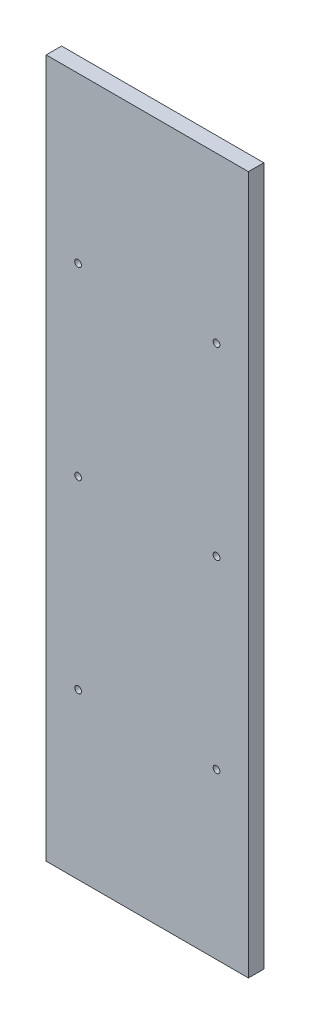
ISO-10303-21;
HEADER;
FILE_DESCRIPTION(('STEP AP214'),'2;1');
FILE_NAME('part.step','',(''),(''),'','','');
FILE_SCHEMA(('AUTOMOTIVE_DESIGN { 1 0 10303 214 1 1 1 1 }'));
ENDSEC;
DATA;
#1=APPLICATION_CONTEXT('core data for automotive mechanical design processes');
#2=APPLICATION_PROTOCOL_DEFINITION('international standard','automotive_design',2000,#1);
#3=PRODUCT_CONTEXT('',#1,'mechanical');
#4=PRODUCT('Part','Part','',(#3));
#5=PRODUCT_RELATED_PRODUCT_CATEGORY('part','',(#4));
#6=PRODUCT_DEFINITION_FORMATION('','',#4);
#7=PRODUCT_DEFINITION_CONTEXT('part definition',#1,'design');
#8=PRODUCT_DEFINITION('design','',#6,#7);
#9=PRODUCT_DEFINITION_SHAPE('','',#8);
#10=(LENGTH_UNIT() NAMED_UNIT(*) SI_UNIT(.MILLI.,.METRE.));
#11=(NAMED_UNIT(*) PLANE_ANGLE_UNIT() SI_UNIT($,.RADIAN.));
#12=(NAMED_UNIT(*) SI_UNIT($,.STERADIAN.) SOLID_ANGLE_UNIT());
#13=UNCERTAINTY_MEASURE_WITH_UNIT(LENGTH_MEASURE(1.E-05),#10,'distance_accuracy_value','');
#14=(GEOMETRIC_REPRESENTATION_CONTEXT(3) GLOBAL_UNCERTAINTY_ASSIGNED_CONTEXT((#13)) GLOBAL_UNIT_ASSIGNED_CONTEXT((#10,
#11,#12)) REPRESENTATION_CONTEXT('',''));
#15=CARTESIAN_POINT('',(0.,0.,0.));
#16=DIRECTION('',(0.,0.,1.));
#17=DIRECTION('',(1.,0.,0.));
#18=AXIS2_PLACEMENT_3D('',#15,#16,#17);
#19=CARTESIAN_POINT('',(0.,0.,6.35));
#20=DIRECTION('',(0.,0.,1.));
#21=DIRECTION('',(1.,0.,0.));
#22=AXIS2_PLACEMENT_3D('',#19,#20,#21);
#23=PLANE('',#22);
#24=CARTESIAN_POINT('',(70.325,-67.945,6.35));
#25=DIRECTION('',(0.,0.,1.));
#26=DIRECTION('',(1.,0.,0.));
#27=AXIS2_PLACEMENT_3D('',#24,#25,#26);
#28=CIRCLE('',#27,1.38906249999997);
#29=CARTESIAN_POINT('',(71.7140625,-67.945,6.35));
#30=VERTEX_POINT('',#29);
#31=EDGE_CURVE('E158',#30,#30,#28,.T.);
#32=ORIENTED_EDGE('',*,*,#31,.F.);
#33=EDGE_LOOP('',(#32));
#34=FACE_BOUND('',#33,.T.);
#35=CARTESIAN_POINT('',(70.325,-144.145,6.35));
#36=DIRECTION('',(0.,0.,1.));
#37=DIRECTION('',(1.,0.,0.));
#38=AXIS2_PLACEMENT_3D('',#35,#36,#37);
#39=CIRCLE('',#38,1.38906249999998);
#40=CARTESIAN_POINT('',(71.7140625,-144.145,6.35));
#41=VERTEX_POINT('',#40);
#42=EDGE_CURVE('E142',#41,#41,#39,.T.);
#43=ORIENTED_EDGE('',*,*,#42,.F.);
#44=EDGE_LOOP('',(#43));
#45=FACE_BOUND('',#44,.T.);
#46=CARTESIAN_POINT('',(13.175,-220.345,6.35));
#47=DIRECTION('',(0.,0.,1.));
#48=DIRECTION('',(1.,0.,0.));
#49=AXIS2_PLACEMENT_3D('',#46,#47,#48);
#50=CIRCLE('',#49,1.38906250000001);
#51=CARTESIAN_POINT('',(14.5640625,-220.345,6.35));
#52=VERTEX_POINT('',#51);
#53=EDGE_CURVE('E112',#52,#52,#50,.T.);
#54=ORIENTED_EDGE('',*,*,#53,.F.);
#55=EDGE_LOOP('',(#54));
#56=FACE_BOUND('',#55,.T.);
#57=DIRECTION('',(0.,1.,0.));
#58=VECTOR('',#57,1.);
#59=CARTESIAN_POINT('',(83.5,-288.29,6.35));
#60=LINE('',#59,#58);
#61=CARTESIAN_POINT('',(83.5,-288.29,6.35));
#62=VERTEX_POINT('',#61);
#63=CARTESIAN_POINT('',(83.5,0.,6.35));
#64=VERTEX_POINT('',#63);
#65=EDGE_CURVE('E92',#62,#64,#60,.T.);
#66=ORIENTED_EDGE('',*,*,#65,.T.);
#67=DIRECTION('',(-1.,0.,0.));
#68=VECTOR('',#67,1.);
#69=CARTESIAN_POINT('',(83.5,0.,6.35));
#70=LINE('',#69,#68);
#71=CARTESIAN_POINT('',(0.,0.,6.35));
#72=VERTEX_POINT('',#71);
#73=EDGE_CURVE('E87',#64,#72,#70,.T.);
#74=ORIENTED_EDGE('',*,*,#73,.T.);
#75=DIRECTION('',(0.,-1.,0.));
#76=VECTOR('',#75,1.);
#77=CARTESIAN_POINT('',(0.,0.,6.35));
#78=LINE('',#77,#76);
#79=CARTESIAN_POINT('',(0.,-288.29,6.35));
#80=VERTEX_POINT('',#79);
#81=EDGE_CURVE('E90',#72,#80,#78,.T.);
#82=ORIENTED_EDGE('',*,*,#81,.T.);
#83=DIRECTION('',(1.,0.,0.));
#84=VECTOR('',#83,1.);
#85=CARTESIAN_POINT('',(0.,-288.29,6.35));
#86=LINE('',#85,#84);
#87=EDGE_CURVE('E57',#80,#62,#86,.T.);
#88=ORIENTED_EDGE('',*,*,#87,.T.);
#89=EDGE_LOOP('',(#66,#74,#82,#88));
#90=FACE_BOUND('',#89,.T.);
#91=CARTESIAN_POINT('',(70.325,-220.345,6.35));
#92=DIRECTION('',(0.,0.,1.));
#93=DIRECTION('',(1.,0.,0.));
#94=AXIS2_PLACEMENT_3D('',#91,#92,#93);
#95=CIRCLE('',#94,1.38906249999998);
#96=CARTESIAN_POINT('',(71.7140625,-220.345,6.35));
#97=VERTEX_POINT('',#96);
#98=EDGE_CURVE('E134',#97,#97,#95,.T.);
#99=ORIENTED_EDGE('',*,*,#98,.F.);
#100=EDGE_LOOP('',(#99));
#101=FACE_BOUND('',#100,.T.);
#102=CARTESIAN_POINT('',(13.175,-67.945,6.35));
#103=DIRECTION('',(0.,0.,1.));
#104=DIRECTION('',(1.,0.,0.));
#105=AXIS2_PLACEMENT_3D('',#102,#103,#104);
#106=CIRCLE('',#105,1.38906250000001);
#107=CARTESIAN_POINT('',(14.5640625,-67.945,6.35));
#108=VERTEX_POINT('',#107);
#109=EDGE_CURVE('E150',#108,#108,#106,.T.);
#110=ORIENTED_EDGE('',*,*,#109,.F.);
#111=EDGE_LOOP('',(#110));
#112=FACE_BOUND('',#111,.T.);
#113=CARTESIAN_POINT('',(13.175,-144.145,6.35));
#114=DIRECTION('',(0.,0.,1.));
#115=DIRECTION('',(1.,0.,0.));
#116=AXIS2_PLACEMENT_3D('',#113,#114,#115);
#117=CIRCLE('',#116,1.38906250000001);
#118=CARTESIAN_POINT('',(14.5640625,-144.145,6.35));
#119=VERTEX_POINT('',#118);
#120=EDGE_CURVE('E166',#119,#119,#117,.T.);
#121=ORIENTED_EDGE('',*,*,#120,.F.);
#122=EDGE_LOOP('',(#121));
#123=FACE_BOUND('',#122,.T.);
#124=ADVANCED_FACE('F39',(#34,#45,#56,#90,#101,#112,#123),#23,.T.);
#125=CARTESIAN_POINT('',(0.,0.,0.));
#126=DIRECTION('',(0.,0.,1.));
#127=DIRECTION('',(1.,0.,0.));
#128=AXIS2_PLACEMENT_3D('',#125,#126,#127);
#129=PLANE('',#128);
#130=DIRECTION('',(0.,1.,0.));
#131=VECTOR('',#130,1.);
#132=CARTESIAN_POINT('',(83.5,-288.29,0.));
#133=LINE('',#132,#131);
#134=CARTESIAN_POINT('',(83.5,-288.29,0.));
#135=VERTEX_POINT('',#134);
#136=CARTESIAN_POINT('',(83.5,0.,0.));
#137=VERTEX_POINT('',#136);
#138=EDGE_CURVE('E108',#135,#137,#133,.T.);
#139=ORIENTED_EDGE('',*,*,#138,.F.);
#140=DIRECTION('',(1.,0.,0.));
#141=VECTOR('',#140,1.);
#142=CARTESIAN_POINT('',(0.,-288.29,0.));
#143=LINE('',#142,#141);
#144=CARTESIAN_POINT('',(0.,-288.29,0.));
#145=VERTEX_POINT('',#144);
#146=EDGE_CURVE('E80',#145,#135,#143,.T.);
#147=ORIENTED_EDGE('',*,*,#146,.F.);
#148=DIRECTION('',(0.,-1.,0.));
#149=VECTOR('',#148,1.);
#150=CARTESIAN_POINT('',(0.,0.,0.));
#151=LINE('',#150,#149);
#152=CARTESIAN_POINT('',(0.,0.,0.));
#153=VERTEX_POINT('',#152);
#154=EDGE_CURVE('E74',#153,#145,#151,.T.);
#155=ORIENTED_EDGE('',*,*,#154,.F.);
#156=DIRECTION('',(-1.,0.,0.));
#157=VECTOR('',#156,1.);
#158=CARTESIAN_POINT('',(83.5,0.,0.));
#159=LINE('',#158,#157);
#160=EDGE_CURVE('E97',#137,#153,#159,.T.);
#161=ORIENTED_EDGE('',*,*,#160,.F.);
#162=EDGE_LOOP('',(#139,#147,#155,#161));
#163=FACE_BOUND('',#162,.T.);
#164=CARTESIAN_POINT('',(13.175,-220.345,0.));
#165=DIRECTION('',(0.,0.,1.));
#166=DIRECTION('',(1.,0.,0.));
#167=AXIS2_PLACEMENT_3D('',#164,#165,#166);
#168=CIRCLE('',#167,1.38906250000001);
#169=CARTESIAN_POINT('',(14.5640625,-220.345,0.));
#170=VERTEX_POINT('',#169);
#171=EDGE_CURVE('E130',#170,#170,#168,.T.);
#172=ORIENTED_EDGE('',*,*,#171,.T.);
#173=EDGE_LOOP('',(#172));
#174=FACE_BOUND('',#173,.T.);
#175=CARTESIAN_POINT('',(70.325,-220.345,0.));
#176=DIRECTION('',(0.,0.,1.));
#177=DIRECTION('',(1.,0.,0.));
#178=AXIS2_PLACEMENT_3D('',#175,#176,#177);
#179=CIRCLE('',#178,1.38906249999998);
#180=CARTESIAN_POINT('',(71.7140625,-220.345,0.));
#181=VERTEX_POINT('',#180);
#182=EDGE_CURVE('E138',#181,#181,#179,.T.);
#183=ORIENTED_EDGE('',*,*,#182,.T.);
#184=EDGE_LOOP('',(#183));
#185=FACE_BOUND('',#184,.T.);
#186=CARTESIAN_POINT('',(70.325,-144.145,0.));
#187=DIRECTION('',(0.,0.,1.));
#188=DIRECTION('',(1.,0.,0.));
#189=AXIS2_PLACEMENT_3D('',#186,#187,#188);
#190=CIRCLE('',#189,1.38906249999998);
#191=CARTESIAN_POINT('',(71.7140625,-144.145,0.));
#192=VERTEX_POINT('',#191);
#193=EDGE_CURVE('E146',#192,#192,#190,.T.);
#194=ORIENTED_EDGE('',*,*,#193,.T.);
#195=EDGE_LOOP('',(#194));
#196=FACE_BOUND('',#195,.T.);
#197=CARTESIAN_POINT('',(13.175,-67.945,0.));
#198=DIRECTION('',(0.,0.,1.));
#199=DIRECTION('',(1.,0.,0.));
#200=AXIS2_PLACEMENT_3D('',#197,#198,#199);
#201=CIRCLE('',#200,1.38906250000001);
#202=CARTESIAN_POINT('',(14.5640625,-67.945,0.));
#203=VERTEX_POINT('',#202);
#204=EDGE_CURVE('E154',#203,#203,#201,.T.);
#205=ORIENTED_EDGE('',*,*,#204,.T.);
#206=EDGE_LOOP('',(#205));
#207=FACE_BOUND('',#206,.T.);
#208=CARTESIAN_POINT('',(70.325,-67.945,0.));
#209=DIRECTION('',(0.,0.,1.));
#210=DIRECTION('',(1.,0.,0.));
#211=AXIS2_PLACEMENT_3D('',#208,#209,#210);
#212=CIRCLE('',#211,1.38906249999997);
#213=CARTESIAN_POINT('',(71.7140625,-67.945,0.));
#214=VERTEX_POINT('',#213);
#215=EDGE_CURVE('E162',#214,#214,#212,.T.);
#216=ORIENTED_EDGE('',*,*,#215,.T.);
#217=EDGE_LOOP('',(#216));
#218=FACE_BOUND('',#217,.T.);
#219=CARTESIAN_POINT('',(13.175,-144.145,0.));
#220=DIRECTION('',(0.,0.,1.));
#221=DIRECTION('',(1.,0.,0.));
#222=AXIS2_PLACEMENT_3D('',#219,#220,#221);
#223=CIRCLE('',#222,1.38906250000001);
#224=CARTESIAN_POINT('',(14.5640625,-144.145,0.));
#225=VERTEX_POINT('',#224);
#226=EDGE_CURVE('E170',#225,#225,#223,.T.);
#227=ORIENTED_EDGE('',*,*,#226,.T.);
#228=EDGE_LOOP('',(#227));
#229=FACE_BOUND('',#228,.T.);
#230=ADVANCED_FACE('F125',(#163,#174,#185,#196,#207,#218,#229),#129,.F.);
#231=CARTESIAN_POINT('',(83.5,-288.29,6.35));
#232=DIRECTION('',(-1.,0.,0.));
#233=DIRECTION('',(0.,0.,1.));
#234=AXIS2_PLACEMENT_3D('',#231,#232,#233);
#235=PLANE('',#234);
#236=ORIENTED_EDGE('',*,*,#138,.T.);
#237=DIRECTION('',(0.,0.,-1.));
#238=VECTOR('',#237,1.);
#239=CARTESIAN_POINT('',(83.5,0.,6.35));
#240=LINE('',#239,#238);
#241=EDGE_CURVE('E11',#64,#137,#240,.T.);
#242=ORIENTED_EDGE('',*,*,#241,.F.);
#243=ORIENTED_EDGE('',*,*,#65,.F.);
#244=DIRECTION('',(0.,0.,-1.));
#245=VECTOR('',#244,1.);
#246=CARTESIAN_POINT('',(83.5,-288.29,6.35));
#247=LINE('',#246,#245);
#248=EDGE_CURVE('E104',#62,#135,#247,.T.);
#249=ORIENTED_EDGE('',*,*,#248,.T.);
#250=EDGE_LOOP('',(#236,#242,#243,#249));
#251=FACE_BOUND('',#250,.T.);
#252=ADVANCED_FACE('F41',(#251),#235,.F.);
#253=CARTESIAN_POINT('',(83.5,0.,6.35));
#254=DIRECTION('',(0.,-1.,0.));
#255=DIRECTION('',(0.,0.,-1.));
#256=AXIS2_PLACEMENT_3D('',#253,#254,#255);
#257=PLANE('',#256);
#258=ORIENTED_EDGE('',*,*,#160,.T.);
#259=DIRECTION('',(0.,0.,-1.));
#260=VECTOR('',#259,1.);
#261=CARTESIAN_POINT('',(0.,0.,6.35));
#262=LINE('',#261,#260);
#263=EDGE_CURVE('E49',#72,#153,#262,.T.);
#264=ORIENTED_EDGE('',*,*,#263,.F.);
#265=ORIENTED_EDGE('',*,*,#73,.F.);
#266=ORIENTED_EDGE('',*,*,#241,.T.);
#267=EDGE_LOOP('',(#258,#264,#265,#266));
#268=FACE_BOUND('',#267,.T.);
#269=ADVANCED_FACE('F96',(#268),#257,.F.);
#270=CARTESIAN_POINT('',(0.,0.,6.35));
#271=DIRECTION('',(1.,0.,0.));
#272=DIRECTION('',(0.,0.,-1.));
#273=AXIS2_PLACEMENT_3D('',#270,#271,#272);
#274=PLANE('',#273);
#275=ORIENTED_EDGE('',*,*,#154,.T.);
#276=DIRECTION('',(0.,0.,-1.));
#277=VECTOR('',#276,1.);
#278=CARTESIAN_POINT('',(0.,-288.29,6.35));
#279=LINE('',#278,#277);
#280=EDGE_CURVE('E99',#80,#145,#279,.T.);
#281=ORIENTED_EDGE('',*,*,#280,.F.);
#282=ORIENTED_EDGE('',*,*,#81,.F.);
#283=ORIENTED_EDGE('',*,*,#263,.T.);
#284=EDGE_LOOP('',(#275,#281,#282,#283));
#285=FACE_BOUND('',#284,.T.);
#286=ADVANCED_FACE('F100',(#285),#274,.F.);
#287=CARTESIAN_POINT('',(0.,-288.29,6.35));
#288=DIRECTION('',(0.,1.,0.));
#289=DIRECTION('',(0.,0.,1.));
#290=AXIS2_PLACEMENT_3D('',#287,#288,#289);
#291=PLANE('',#290);
#292=ORIENTED_EDGE('',*,*,#146,.T.);
#293=ORIENTED_EDGE('',*,*,#248,.F.);
#294=ORIENTED_EDGE('',*,*,#87,.F.);
#295=ORIENTED_EDGE('',*,*,#280,.T.);
#296=EDGE_LOOP('',(#292,#293,#294,#295));
#297=FACE_BOUND('',#296,.T.);
#298=ADVANCED_FACE('F122',(#297),#291,.F.);
#299=CARTESIAN_POINT('',(13.175,-220.345,6.35));
#300=DIRECTION('',(0.,0.,-1.));
#301=DIRECTION('',(-1.,0.,0.));
#302=AXIS2_PLACEMENT_3D('',#299,#300,#301);
#303=CYLINDRICAL_SURFACE('',#302,1.38906250000001);
#304=ORIENTED_EDGE('',*,*,#53,.T.);
#305=EDGE_LOOP('',(#304));
#306=FACE_BOUND('',#305,.T.);
#307=ORIENTED_EDGE('',*,*,#171,.F.);
#308=EDGE_LOOP('',(#307));
#309=FACE_BOUND('',#308,.T.);
#310=ADVANCED_FACE('F191',(#306,#309),#303,.F.);
#311=CARTESIAN_POINT('',(70.325,-220.345,6.35));
#312=DIRECTION('',(0.,0.,-1.));
#313=DIRECTION('',(-1.,0.,0.));
#314=AXIS2_PLACEMENT_3D('',#311,#312,#313);
#315=CYLINDRICAL_SURFACE('',#314,1.38906249999998);
#316=ORIENTED_EDGE('',*,*,#98,.T.);
#317=EDGE_LOOP('',(#316));
#318=FACE_BOUND('',#317,.T.);
#319=ORIENTED_EDGE('',*,*,#182,.F.);
#320=EDGE_LOOP('',(#319));
#321=FACE_BOUND('',#320,.T.);
#322=ADVANCED_FACE('F237',(#318,#321),#315,.F.);
#323=CARTESIAN_POINT('',(70.325,-144.145,6.35));
#324=DIRECTION('',(0.,0.,-1.));
#325=DIRECTION('',(-1.,0.,0.));
#326=AXIS2_PLACEMENT_3D('',#323,#324,#325);
#327=CYLINDRICAL_SURFACE('',#326,1.38906249999998);
#328=ORIENTED_EDGE('',*,*,#42,.T.);
#329=EDGE_LOOP('',(#328));
#330=FACE_BOUND('',#329,.T.);
#331=ORIENTED_EDGE('',*,*,#193,.F.);
#332=EDGE_LOOP('',(#331));
#333=FACE_BOUND('',#332,.T.);
#334=ADVANCED_FACE('F245',(#330,#333),#327,.F.);
#335=CARTESIAN_POINT('',(13.175,-67.945,6.35));
#336=DIRECTION('',(0.,0.,-1.));
#337=DIRECTION('',(-1.,0.,0.));
#338=AXIS2_PLACEMENT_3D('',#335,#336,#337);
#339=CYLINDRICAL_SURFACE('',#338,1.38906250000001);
#340=ORIENTED_EDGE('',*,*,#109,.T.);
#341=EDGE_LOOP('',(#340));
#342=FACE_BOUND('',#341,.T.);
#343=ORIENTED_EDGE('',*,*,#204,.F.);
#344=EDGE_LOOP('',(#343));
#345=FACE_BOUND('',#344,.T.);
#346=ADVANCED_FACE('F253',(#342,#345),#339,.F.);
#347=CARTESIAN_POINT('',(70.325,-67.945,6.35));
#348=DIRECTION('',(0.,0.,-1.));
#349=DIRECTION('',(-1.,0.,0.));
#350=AXIS2_PLACEMENT_3D('',#347,#348,#349);
#351=CYLINDRICAL_SURFACE('',#350,1.38906249999997);
#352=ORIENTED_EDGE('',*,*,#31,.T.);
#353=EDGE_LOOP('',(#352));
#354=FACE_BOUND('',#353,.T.);
#355=ORIENTED_EDGE('',*,*,#215,.F.);
#356=EDGE_LOOP('',(#355));
#357=FACE_BOUND('',#356,.T.);
#358=ADVANCED_FACE('F262',(#354,#357),#351,.F.);
#359=CARTESIAN_POINT('',(13.175,-144.145,6.35));
#360=DIRECTION('',(0.,0.,-1.));
#361=DIRECTION('',(-1.,0.,0.));
#362=AXIS2_PLACEMENT_3D('',#359,#360,#361);
#363=CYLINDRICAL_SURFACE('',#362,1.38906250000001);
#364=ORIENTED_EDGE('',*,*,#120,.T.);
#365=EDGE_LOOP('',(#364));
#366=FACE_BOUND('',#365,.T.);
#367=ORIENTED_EDGE('',*,*,#226,.F.);
#368=EDGE_LOOP('',(#367));
#369=FACE_BOUND('',#368,.T.);
#370=ADVANCED_FACE('F178',(#366,#369),#363,.F.);
#371=CLOSED_SHELL('',(#124,#230,#252,#269,#286,#298,#310,#322,#334,#346,#358,#370));
#372=MANIFOLD_SOLID_BREP('B2',#371);
#373=ADVANCED_BREP_SHAPE_REPRESENTATION('',(#18,#372),#14);
#374=SHAPE_DEFINITION_REPRESENTATION(#9,#373);
ENDSEC;
END-ISO-10303-21;
